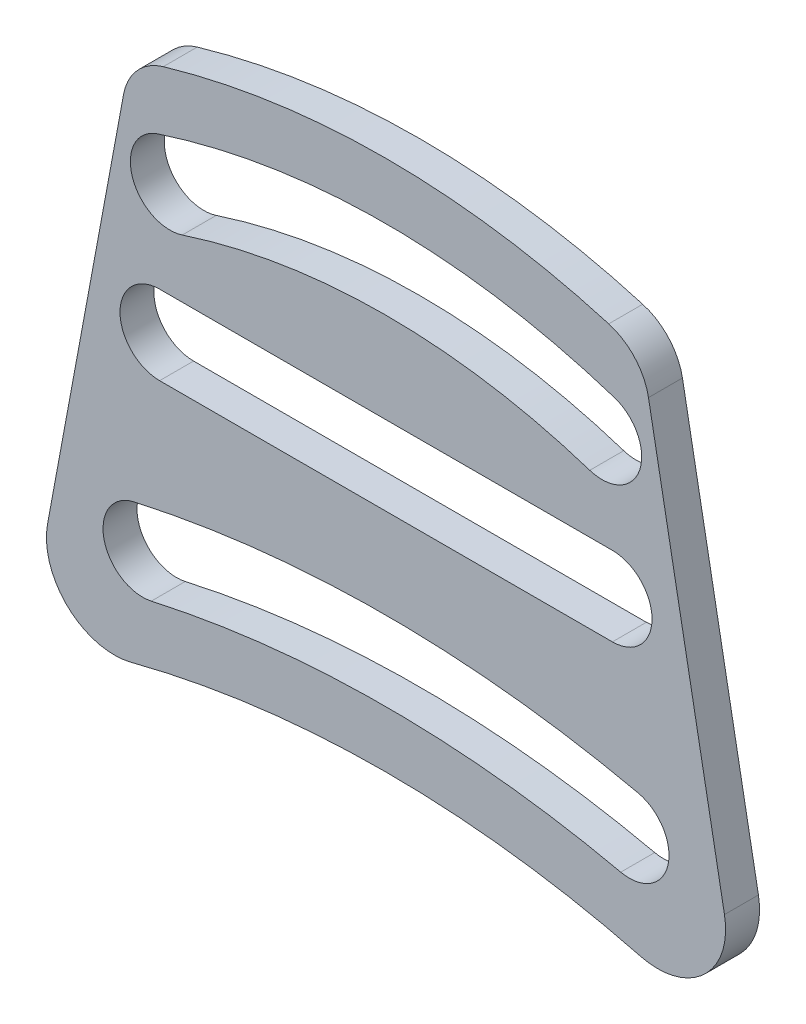
ISO-10303-21;
HEADER;
FILE_DESCRIPTION(('STEP AP214'),'2;1');
FILE_NAME('part.step','',(''),(''),'','','');
FILE_SCHEMA(('AUTOMOTIVE_DESIGN { 1 0 10303 214 1 1 1 1 }'));
ENDSEC;
DATA;
#1=APPLICATION_CONTEXT('core data for automotive mechanical design processes');
#2=APPLICATION_PROTOCOL_DEFINITION('international standard','automotive_design',2000,#1);
#3=PRODUCT_CONTEXT('',#1,'mechanical');
#4=PRODUCT('Part','Part','',(#3));
#5=PRODUCT_RELATED_PRODUCT_CATEGORY('part','',(#4));
#6=PRODUCT_DEFINITION_FORMATION('','',#4);
#7=PRODUCT_DEFINITION_CONTEXT('part definition',#1,'design');
#8=PRODUCT_DEFINITION('design','',#6,#7);
#9=PRODUCT_DEFINITION_SHAPE('','',#8);
#10=(LENGTH_UNIT() NAMED_UNIT(*) SI_UNIT(.MILLI.,.METRE.));
#11=(NAMED_UNIT(*) PLANE_ANGLE_UNIT() SI_UNIT($,.RADIAN.));
#12=(NAMED_UNIT(*) SI_UNIT($,.STERADIAN.) SOLID_ANGLE_UNIT());
#13=UNCERTAINTY_MEASURE_WITH_UNIT(LENGTH_MEASURE(1.E-05),#10,'distance_accuracy_value','');
#14=(GEOMETRIC_REPRESENTATION_CONTEXT(3) GLOBAL_UNCERTAINTY_ASSIGNED_CONTEXT((#13)) GLOBAL_UNIT_ASSIGNED_CONTEXT((#10,
#11,#12)) REPRESENTATION_CONTEXT('',''));
#15=CARTESIAN_POINT('',(0.,0.,0.));
#16=DIRECTION('',(0.,0.,1.));
#17=DIRECTION('',(1.,0.,0.));
#18=AXIS2_PLACEMENT_3D('',#15,#16,#17);
#19=CARTESIAN_POINT('',(0.,0.,3.));
#20=DIRECTION('',(0.,0.,1.));
#21=DIRECTION('',(1.,0.,0.));
#22=AXIS2_PLACEMENT_3D('',#19,#20,#21);
#23=PLANE('',#22);
#24=CARTESIAN_POINT('',(-24.,-38.028860434751,3.));
#25=DIRECTION('',(0.,0.,1.));
#26=DIRECTION('',(1.,0.,0.));
#27=AXIS2_PLACEMENT_3D('',#24,#25,#26);
#28=CIRCLE('',#27,6.);
#29=CARTESIAN_POINT('',(-22.5,-43.8383354540621,3.));
#30=VERTEX_POINT('',#29);
#31=CARTESIAN_POINT('',(-29.8994233722071,-36.9348751169989,3.));
#32=VERTEX_POINT('',#31);
#33=EDGE_CURVE('E263',#30,#32,#28,.F.);
#34=ORIENTED_EDGE('',*,*,#33,.F.);
#35=CARTESIAN_POINT('',(0.,-130.980460743729,3.));
#36=DIRECTION('',(0.,0.,1.));
#37=DIRECTION('',(1.,0.,0.));
#38=AXIS2_PLACEMENT_3D('',#35,#36,#37);
#39=CIRCLE('',#38,90.);
#40=CARTESIAN_POINT('',(22.5,-43.8383354540621,3.));
#41=VERTEX_POINT('',#40);
#42=EDGE_CURVE('E267',#30,#41,#39,.F.);
#43=ORIENTED_EDGE('',*,*,#42,.T.);
#44=CARTESIAN_POINT('',(24.,-38.028860434751,3.));
#45=DIRECTION('',(0.,0.,1.));
#46=DIRECTION('',(1.,0.,0.));
#47=AXIS2_PLACEMENT_3D('',#44,#45,#46);
#48=CIRCLE('',#47,6.);
#49=CARTESIAN_POINT('',(29.8994233722071,-36.9348751169989,3.));
#50=VERTEX_POINT('',#49);
#51=EDGE_CURVE('E271',#41,#50,#48,.T.);
#52=ORIENTED_EDGE('',*,*,#51,.T.);
#53=DIRECTION('',(-0.18233088629201,0.983237228701177,0.));
#54=VECTOR('',#53,1.);
#55=CARTESIAN_POINT('',(22.2839485983631,4.13232125414158,3.));
#56=LINE('',#55,#54);
#57=CARTESIAN_POINT('',(23.1870846036624,-0.737928438873364,3.));
#58=VERTEX_POINT('',#57);
#59=EDGE_CURVE('E274',#50,#58,#56,.T.);
#60=ORIENTED_EDGE('',*,*,#59,.T.);
#61=CARTESIAN_POINT('',(18.2708984601565,-1.64958287033342,3.));
#62=DIRECTION('',(0.,0.,1.));
#63=DIRECTION('',(1.,0.,0.));
#64=AXIS2_PLACEMENT_3D('',#61,#62,#63);
#65=CIRCLE('',#64,5.);
#66=CARTESIAN_POINT('',(19.6763521878609,3.14882309616023,3.));
#67=VERTEX_POINT('',#66);
#68=EDGE_CURVE('E277',#67,#58,#65,.F.);
#69=ORIENTED_EDGE('',*,*,#68,.F.);
#70=CARTESIAN_POINT('',(0.,-64.028860434751,3.));
#71=DIRECTION('',(0.,0.,1.));
#72=DIRECTION('',(1.,0.,0.));
#73=AXIS2_PLACEMENT_3D('',#70,#71,#72);
#74=CIRCLE('',#73,70.);
#75=CARTESIAN_POINT('',(-19.6763521878609,3.14882309616023,3.));
#76=VERTEX_POINT('',#75);
#77=EDGE_CURVE('E281',#76,#67,#74,.F.);
#78=ORIENTED_EDGE('',*,*,#77,.F.);
#79=CARTESIAN_POINT('',(-18.2708984601565,-1.64958287033342,3.));
#80=DIRECTION('',(0.,0.,1.));
#81=DIRECTION('',(1.,0.,0.));
#82=AXIS2_PLACEMENT_3D('',#79,#80,#81);
#83=CIRCLE('',#82,5.);
#84=CARTESIAN_POINT('',(-23.1870846036624,-0.737928438873364,3.));
#85=VERTEX_POINT('',#84);
#86=EDGE_CURVE('E285',#76,#85,#83,.T.);
#87=ORIENTED_EDGE('',*,*,#86,.T.);
#88=DIRECTION('',(0.18233088629201,0.983237228701177,0.));
#89=VECTOR('',#88,1.);
#90=CARTESIAN_POINT('',(-22.2839485983631,4.13232125414158,3.));
#91=LINE('',#90,#89);
#92=EDGE_CURVE('E288',#32,#85,#91,.T.);
#93=ORIENTED_EDGE('',*,*,#92,.F.);
#94=EDGE_LOOP('',(#34,#43,#52,#60,#69,#78,#87,#93));
#95=FACE_BOUND('',#94,.T.);
#96=CARTESIAN_POINT('',(-19.0864097940856,-5.56554748404458,3.));
#97=DIRECTION('',(0.,0.,1.));
#98=DIRECTION('',(1.,0.,0.));
#99=AXIS2_PLACEMENT_3D('',#96,#97,#98);
#100=CIRCLE('',#99,3.49999999999999);
#101=CARTESIAN_POINT('',(-20.1726282376514,-2.23836707221577,3.));
#102=VERTEX_POINT('',#101);
#103=CARTESIAN_POINT('',(-18.0001913505198,-8.89272789587339,3.));
#104=VERTEX_POINT('',#103);
#105=EDGE_CURVE('E292',#102,#104,#100,.T.);
#106=ORIENTED_EDGE('',*,*,#105,.F.);
#107=CARTESIAN_POINT('',(0.,-64.028860434751,3.));
#108=DIRECTION('',(0.,0.,1.));
#109=DIRECTION('',(1.,0.,0.));
#110=AXIS2_PLACEMENT_3D('',#107,#108,#109);
#111=CIRCLE('',#110,65.);
#112=CARTESIAN_POINT('',(20.1726282376514,-2.23836707221578,3.));
#113=VERTEX_POINT('',#112);
#114=EDGE_CURVE('E296',#113,#102,#111,.T.);
#115=ORIENTED_EDGE('',*,*,#114,.F.);
#116=CARTESIAN_POINT('',(19.0864097940856,-5.56554748404458,3.));
#117=DIRECTION('',(0.,0.,1.));
#118=DIRECTION('',(1.,0.,0.));
#119=AXIS2_PLACEMENT_3D('',#116,#117,#118);
#120=CIRCLE('',#119,3.49999999999999);
#121=CARTESIAN_POINT('',(18.0001913505197,-8.89272789587339,3.));
#122=VERTEX_POINT('',#121);
#123=EDGE_CURVE('E300',#122,#113,#120,.T.);
#124=ORIENTED_EDGE('',*,*,#123,.F.);
#125=CARTESIAN_POINT('',(0.,-64.028860434751,3.));
#126=DIRECTION('',(0.,0.,1.));
#127=DIRECTION('',(1.,0.,0.));
#128=AXIS2_PLACEMENT_3D('',#125,#126,#127);
#129=CIRCLE('',#128,58.);
#130=EDGE_CURVE('E304',#122,#104,#129,.T.);
#131=ORIENTED_EDGE('',*,*,#130,.T.);
#132=EDGE_LOOP('',(#106,#115,#124,#131));
#133=FACE_BOUND('',#132,.T.);
#134=CARTESIAN_POINT('',(20.0000034189716,-17.5208455907472,3.));
#135=DIRECTION('',(0.,0.,1.));
#136=DIRECTION('',(1.,0.,0.));
#137=AXIS2_PLACEMENT_3D('',#134,#135,#136);
#138=CIRCLE('',#137,3.5);
#139=CARTESIAN_POINT('',(20.0000034189716,-21.0208455907472,3.));
#140=VERTEX_POINT('',#139);
#141=CARTESIAN_POINT('',(20.0000034189716,-14.0208455907472,3.));
#142=VERTEX_POINT('',#141);
#143=EDGE_CURVE('E307',#140,#142,#138,.T.);
#144=ORIENTED_EDGE('',*,*,#143,.F.);
#145=DIRECTION('',(0.999999919670687,0.000400822428792743,0.));
#146=VECTOR('',#145,1.);
#147=CARTESIAN_POINT('',(0.00842883888107348,-21.0288586628694,3.));
#148=LINE('',#147,#146);
#149=CARTESIAN_POINT('',(-19.9999933678559,-21.0368784878989,3.));
#150=VERTEX_POINT('',#149);
#151=EDGE_CURVE('E311',#150,#140,#148,.T.);
#152=ORIENTED_EDGE('',*,*,#151,.F.);
#153=CARTESIAN_POINT('',(-19.9999933678559,-17.5368784878989,3.));
#154=DIRECTION('',(0.,0.,1.));
#155=DIRECTION('',(1.,0.,0.));
#156=AXIS2_PLACEMENT_3D('',#153,#154,#155);
#157=CIRCLE('',#156,3.5);
#158=CARTESIAN_POINT('',(-19.9999933678559,-14.0368784878989,3.));
#159=VERTEX_POINT('',#158);
#160=EDGE_CURVE('E315',#159,#150,#157,.T.);
#161=ORIENTED_EDGE('',*,*,#160,.F.);
#162=DIRECTION('',(0.999999919670687,0.0004008224287927,0.));
#163=VECTOR('',#162,1.);
#164=CARTESIAN_POINT('',(0.0056230821049082,-14.0288597874798,3.));
#165=LINE('',#164,#163);
#166=EDGE_CURVE('E319',#159,#142,#165,.T.);
#167=ORIENTED_EDGE('',*,*,#166,.T.);
#168=EDGE_LOOP('',(#144,#152,#161,#167));
#169=FACE_BOUND('',#168,.T.);
#170=CARTESIAN_POINT('',(0.,-130.980460743729,3.));
#171=DIRECTION('',(0.,0.,1.));
#172=DIRECTION('',(1.,0.,0.));
#173=AXIS2_PLACEMENT_3D('',#170,#171,#172);
#174=CIRCLE('',#173,102.);
#175=CARTESIAN_POINT('',(22.263959390863,-31.4399357690133,3.));
#176=VERTEX_POINT('',#175);
#177=CARTESIAN_POINT('',(-22.263959390863,-31.4399357690133,3.));
#178=VERTEX_POINT('',#177);
#179=EDGE_CURVE('E225',#176,#178,#174,.T.);
#180=ORIENTED_EDGE('',*,*,#179,.F.);
#181=CARTESIAN_POINT('',(21.5000000000001,-34.8555420181457,3.));
#182=DIRECTION('',(0.,0.,1.));
#183=DIRECTION('',(1.,0.,0.));
#184=AXIS2_PLACEMENT_3D('',#181,#182,#183);
#185=CIRCLE('',#184,3.5);
#186=CARTESIAN_POINT('',(20.7360406091371,-38.2711482672781,3.));
#187=VERTEX_POINT('',#186);
#188=EDGE_CURVE('E216',#187,#176,#185,.T.);
#189=ORIENTED_EDGE('',*,*,#188,.F.);
#190=CARTESIAN_POINT('',(0.,-130.980460743729,3.));
#191=DIRECTION('',(0.,0.,1.));
#192=DIRECTION('',(1.,0.,0.));
#193=AXIS2_PLACEMENT_3D('',#190,#191,#192);
#194=CIRCLE('',#193,95.);
#195=CARTESIAN_POINT('',(-20.7360406091371,-38.2711482672781,3.));
#196=VERTEX_POINT('',#195);
#197=EDGE_CURVE('E242',#187,#196,#194,.T.);
#198=ORIENTED_EDGE('',*,*,#197,.T.);
#199=CARTESIAN_POINT('',(-21.5000000000001,-34.8555420181457,3.));
#200=DIRECTION('',(0.,0.,1.));
#201=DIRECTION('',(1.,0.,0.));
#202=AXIS2_PLACEMENT_3D('',#199,#200,#201);
#203=CIRCLE('',#202,3.5);
#204=EDGE_CURVE('E238',#178,#196,#203,.T.);
#205=ORIENTED_EDGE('',*,*,#204,.F.);
#206=EDGE_LOOP('',(#180,#189,#198,#205));
#207=FACE_BOUND('',#206,.T.);
#208=ADVANCED_FACE('F77',(#95,#133,#169,#207),#23,.T.);
#209=CARTESIAN_POINT('',(0.,0.,0.));
#210=DIRECTION('',(0.,0.,1.));
#211=DIRECTION('',(1.,0.,0.));
#212=AXIS2_PLACEMENT_3D('',#209,#210,#211);
#213=PLANE('',#212);
#214=CARTESIAN_POINT('',(20.0000034189716,-17.5208455907472,0.));
#215=DIRECTION('',(0.,0.,1.));
#216=DIRECTION('',(1.,0.,0.));
#217=AXIS2_PLACEMENT_3D('',#214,#215,#216);
#218=CIRCLE('',#217,3.5);
#219=CARTESIAN_POINT('',(20.0000034189716,-21.0208455907472,0.));
#220=VERTEX_POINT('',#219);
#221=CARTESIAN_POINT('',(20.0000034189716,-14.0208455907472,0.));
#222=VERTEX_POINT('',#221);
#223=EDGE_CURVE('E368',#220,#222,#218,.T.);
#224=ORIENTED_EDGE('',*,*,#223,.T.);
#225=DIRECTION('',(0.999999919670687,0.0004008224287927,0.));
#226=VECTOR('',#225,1.);
#227=CARTESIAN_POINT('',(0.0056230821049082,-14.0288597874798,0.));
#228=LINE('',#227,#226);
#229=CARTESIAN_POINT('',(-19.9999933678559,-14.0368784878989,0.));
#230=VERTEX_POINT('',#229);
#231=EDGE_CURVE('E268',#230,#222,#228,.T.);
#232=ORIENTED_EDGE('',*,*,#231,.F.);
#233=CARTESIAN_POINT('',(-19.9999933678559,-17.5368784878989,0.));
#234=DIRECTION('',(0.,0.,1.));
#235=DIRECTION('',(1.,0.,0.));
#236=AXIS2_PLACEMENT_3D('',#233,#234,#235);
#237=CIRCLE('',#236,3.5);
#238=CARTESIAN_POINT('',(-19.9999933678559,-21.0368784878989,0.));
#239=VERTEX_POINT('',#238);
#240=EDGE_CURVE('E376',#230,#239,#237,.T.);
#241=ORIENTED_EDGE('',*,*,#240,.T.);
#242=DIRECTION('',(0.999999919670687,0.000400822428792743,0.));
#243=VECTOR('',#242,1.);
#244=CARTESIAN_POINT('',(0.00842883888107348,-21.0288586628694,0.));
#245=LINE('',#244,#243);
#246=EDGE_CURVE('E372',#239,#220,#245,.T.);
#247=ORIENTED_EDGE('',*,*,#246,.T.);
#248=EDGE_LOOP('',(#224,#232,#241,#247));
#249=FACE_BOUND('',#248,.T.);
#250=CARTESIAN_POINT('',(-19.0864097940856,-5.56554748404458,0.));
#251=DIRECTION('',(0.,0.,1.));
#252=DIRECTION('',(1.,0.,0.));
#253=AXIS2_PLACEMENT_3D('',#250,#251,#252);
#254=CIRCLE('',#253,3.49999999999999);
#255=CARTESIAN_POINT('',(-20.1726282376514,-2.23836707221577,0.));
#256=VERTEX_POINT('',#255);
#257=CARTESIAN_POINT('',(-18.0001913505198,-8.89272789587339,0.));
#258=VERTEX_POINT('',#257);
#259=EDGE_CURVE('E352',#256,#258,#254,.T.);
#260=ORIENTED_EDGE('',*,*,#259,.T.);
#261=CARTESIAN_POINT('',(0.,-64.028860434751,0.));
#262=DIRECTION('',(0.,0.,1.));
#263=DIRECTION('',(1.,0.,0.));
#264=AXIS2_PLACEMENT_3D('',#261,#262,#263);
#265=CIRCLE('',#264,58.);
#266=CARTESIAN_POINT('',(18.0001913505197,-8.89272789587339,0.));
#267=VERTEX_POINT('',#266);
#268=EDGE_CURVE('E364',#267,#258,#265,.T.);
#269=ORIENTED_EDGE('',*,*,#268,.F.);
#270=CARTESIAN_POINT('',(19.0864097940856,-5.56554748404458,0.));
#271=DIRECTION('',(0.,0.,1.));
#272=DIRECTION('',(1.,0.,0.));
#273=AXIS2_PLACEMENT_3D('',#270,#271,#272);
#274=CIRCLE('',#273,3.49999999999999);
#275=CARTESIAN_POINT('',(20.1726282376514,-2.23836707221578,0.));
#276=VERTEX_POINT('',#275);
#277=EDGE_CURVE('E360',#267,#276,#274,.T.);
#278=ORIENTED_EDGE('',*,*,#277,.T.);
#279=CARTESIAN_POINT('',(0.,-64.028860434751,0.));
#280=DIRECTION('',(0.,0.,1.));
#281=DIRECTION('',(1.,0.,0.));
#282=AXIS2_PLACEMENT_3D('',#279,#280,#281);
#283=CIRCLE('',#282,65.);
#284=EDGE_CURVE('E356',#276,#256,#283,.T.);
#285=ORIENTED_EDGE('',*,*,#284,.T.);
#286=EDGE_LOOP('',(#260,#269,#278,#285));
#287=FACE_BOUND('',#286,.T.);
#288=CARTESIAN_POINT('',(-24.,-38.028860434751,0.));
#289=DIRECTION('',(0.,0.,1.));
#290=DIRECTION('',(1.,0.,0.));
#291=AXIS2_PLACEMENT_3D('',#288,#289,#290);
#292=CIRCLE('',#291,6.);
#293=CARTESIAN_POINT('',(-22.5,-43.8383354540621,0.));
#294=VERTEX_POINT('',#293);
#295=CARTESIAN_POINT('',(-29.8994233722071,-36.9348751169989,0.));
#296=VERTEX_POINT('',#295);
#297=EDGE_CURVE('E234',#294,#296,#292,.F.);
#298=ORIENTED_EDGE('',*,*,#297,.T.);
#299=DIRECTION('',(0.18233088629201,0.983237228701177,0.));
#300=VECTOR('',#299,1.);
#301=CARTESIAN_POINT('',(-22.2839485983631,4.13232125414158,0.));
#302=LINE('',#301,#300);
#303=CARTESIAN_POINT('',(-23.1870846036624,-0.737928438873364,0.));
#304=VERTEX_POINT('',#303);
#305=EDGE_CURVE('E348',#296,#304,#302,.T.);
#306=ORIENTED_EDGE('',*,*,#305,.T.);
#307=CARTESIAN_POINT('',(-18.2708984601565,-1.64958287033342,0.));
#308=DIRECTION('',(0.,0.,1.));
#309=DIRECTION('',(1.,0.,0.));
#310=AXIS2_PLACEMENT_3D('',#307,#308,#309);
#311=CIRCLE('',#310,5.);
#312=CARTESIAN_POINT('',(-19.6763521878609,3.14882309616023,0.));
#313=VERTEX_POINT('',#312);
#314=EDGE_CURVE('E344',#313,#304,#311,.T.);
#315=ORIENTED_EDGE('',*,*,#314,.F.);
#316=CARTESIAN_POINT('',(0.,-64.028860434751,0.));
#317=DIRECTION('',(0.,0.,1.));
#318=DIRECTION('',(1.,0.,0.));
#319=AXIS2_PLACEMENT_3D('',#316,#317,#318);
#320=CIRCLE('',#319,70.);
#321=CARTESIAN_POINT('',(19.6763521878609,3.14882309616023,0.));
#322=VERTEX_POINT('',#321);
#323=EDGE_CURVE('E340',#313,#322,#320,.F.);
#324=ORIENTED_EDGE('',*,*,#323,.T.);
#325=CARTESIAN_POINT('',(18.2708984601565,-1.64958287033342,0.));
#326=DIRECTION('',(0.,0.,1.));
#327=DIRECTION('',(1.,0.,0.));
#328=AXIS2_PLACEMENT_3D('',#325,#326,#327);
#329=CIRCLE('',#328,5.);
#330=CARTESIAN_POINT('',(23.1870846036624,-0.737928438873364,0.));
#331=VERTEX_POINT('',#330);
#332=EDGE_CURVE('E336',#322,#331,#329,.F.);
#333=ORIENTED_EDGE('',*,*,#332,.T.);
#334=DIRECTION('',(-0.18233088629201,0.983237228701177,0.));
#335=VECTOR('',#334,1.);
#336=CARTESIAN_POINT('',(22.2839485983631,4.13232125414158,0.));
#337=LINE('',#336,#335);
#338=CARTESIAN_POINT('',(29.8994233722071,-36.9348751169989,0.));
#339=VERTEX_POINT('',#338);
#340=EDGE_CURVE('E332',#339,#331,#337,.T.);
#341=ORIENTED_EDGE('',*,*,#340,.F.);
#342=CARTESIAN_POINT('',(24.,-38.028860434751,0.));
#343=DIRECTION('',(0.,0.,1.));
#344=DIRECTION('',(1.,0.,0.));
#345=AXIS2_PLACEMENT_3D('',#342,#343,#344);
#346=CIRCLE('',#345,6.);
#347=CARTESIAN_POINT('',(22.5,-43.8383354540621,0.));
#348=VERTEX_POINT('',#347);
#349=EDGE_CURVE('E329',#348,#339,#346,.T.);
#350=ORIENTED_EDGE('',*,*,#349,.F.);
#351=CARTESIAN_POINT('',(0.,-130.980460743729,0.));
#352=DIRECTION('',(0.,0.,1.));
#353=DIRECTION('',(1.,0.,0.));
#354=AXIS2_PLACEMENT_3D('',#351,#352,#353);
#355=CIRCLE('',#354,90.);
#356=EDGE_CURVE('E326',#294,#348,#355,.F.);
#357=ORIENTED_EDGE('',*,*,#356,.F.);
#358=EDGE_LOOP('',(#298,#306,#315,#324,#333,#341,#350,#357));
#359=FACE_BOUND('',#358,.T.);
#360=CARTESIAN_POINT('',(21.5000000000001,-34.8555420181457,0.));
#361=DIRECTION('',(0.,0.,1.));
#362=DIRECTION('',(1.,0.,0.));
#363=AXIS2_PLACEMENT_3D('',#360,#361,#362);
#364=CIRCLE('',#363,3.5);
#365=CARTESIAN_POINT('',(20.7360406091371,-38.2711482672781,0.));
#366=VERTEX_POINT('',#365);
#367=CARTESIAN_POINT('',(22.263959390863,-31.4399357690133,0.));
#368=VERTEX_POINT('',#367);
#369=EDGE_CURVE('E103',#366,#368,#364,.T.);
#370=ORIENTED_EDGE('',*,*,#369,.T.);
#371=CARTESIAN_POINT('',(0.,-130.980460743729,0.));
#372=DIRECTION('',(0.,0.,1.));
#373=DIRECTION('',(1.,0.,0.));
#374=AXIS2_PLACEMENT_3D('',#371,#372,#373);
#375=CIRCLE('',#374,102.);
#376=CARTESIAN_POINT('',(-22.263959390863,-31.4399357690133,0.));
#377=VERTEX_POINT('',#376);
#378=EDGE_CURVE('E232',#368,#377,#375,.T.);
#379=ORIENTED_EDGE('',*,*,#378,.T.);
#380=CARTESIAN_POINT('',(-21.5000000000001,-34.8555420181457,0.));
#381=DIRECTION('',(0.,0.,1.));
#382=DIRECTION('',(1.,0.,0.));
#383=AXIS2_PLACEMENT_3D('',#380,#381,#382);
#384=CIRCLE('',#383,3.5);
#385=CARTESIAN_POINT('',(-20.7360406091371,-38.2711482672781,0.));
#386=VERTEX_POINT('',#385);
#387=EDGE_CURVE('E251',#377,#386,#384,.T.);
#388=ORIENTED_EDGE('',*,*,#387,.T.);
#389=CARTESIAN_POINT('',(0.,-130.980460743729,0.));
#390=DIRECTION('',(0.,0.,1.));
#391=DIRECTION('',(1.,0.,0.));
#392=AXIS2_PLACEMENT_3D('',#389,#390,#391);
#393=CIRCLE('',#392,95.);
#394=EDGE_CURVE('E226',#366,#386,#393,.T.);
#395=ORIENTED_EDGE('',*,*,#394,.F.);
#396=EDGE_LOOP('',(#370,#379,#388,#395));
#397=FACE_BOUND('',#396,.T.);
#398=ADVANCED_FACE('F436',(#249,#287,#359,#397),#213,.F.);
#399=CARTESIAN_POINT('',(20.0000034189716,-17.5208455907472,3.));
#400=DIRECTION('',(0.,0.,-1.));
#401=DIRECTION('',(-1.,0.,0.));
#402=AXIS2_PLACEMENT_3D('',#399,#400,#401);
#403=CYLINDRICAL_SURFACE('',#402,3.5);
#404=ORIENTED_EDGE('',*,*,#223,.F.);
#405=DIRECTION('',(0.,0.,-1.));
#406=VECTOR('',#405,1.);
#407=CARTESIAN_POINT('',(20.0000034189716,-21.0208455907472,3.));
#408=LINE('',#407,#406);
#409=EDGE_CURVE('E12',#140,#220,#408,.T.);
#410=ORIENTED_EDGE('',*,*,#409,.F.);
#411=ORIENTED_EDGE('',*,*,#143,.T.);
#412=DIRECTION('',(0.,0.,-1.));
#413=VECTOR('',#412,1.);
#414=CARTESIAN_POINT('',(20.0000034189716,-14.0208455907472,3.));
#415=LINE('',#414,#413);
#416=EDGE_CURVE('E383',#142,#222,#415,.T.);
#417=ORIENTED_EDGE('',*,*,#416,.T.);
#418=EDGE_LOOP('',(#404,#410,#411,#417));
#419=FACE_BOUND('',#418,.T.);
#420=ADVANCED_FACE('F480',(#419),#403,.F.);
#421=CARTESIAN_POINT('',(0.00842883888107348,-21.0288586628694,3.));
#422=DIRECTION('',(-0.000400822428792743,0.999999919670687,0.));
#423=DIRECTION('',(-0.999999919670687,-0.000400822428792743,0.));
#424=AXIS2_PLACEMENT_3D('',#421,#422,#423);
#425=PLANE('',#424);
#426=ORIENTED_EDGE('',*,*,#246,.F.);
#427=DIRECTION('',(0.,0.,-1.));
#428=VECTOR('',#427,1.);
#429=CARTESIAN_POINT('',(-19.9999933678559,-21.0368784878989,3.));
#430=LINE('',#429,#428);
#431=EDGE_CURVE('E87',#150,#239,#430,.T.);
#432=ORIENTED_EDGE('',*,*,#431,.F.);
#433=ORIENTED_EDGE('',*,*,#151,.T.);
#434=ORIENTED_EDGE('',*,*,#409,.T.);
#435=EDGE_LOOP('',(#426,#432,#433,#434));
#436=FACE_BOUND('',#435,.T.);
#437=ADVANCED_FACE('F494',(#436),#425,.T.);
#438=CARTESIAN_POINT('',(-19.9999933678559,-17.5368784878989,3.));
#439=DIRECTION('',(0.,0.,-1.));
#440=DIRECTION('',(-1.,0.,0.));
#441=AXIS2_PLACEMENT_3D('',#438,#439,#440);
#442=CYLINDRICAL_SURFACE('',#441,3.5);
#443=ORIENTED_EDGE('',*,*,#240,.F.);
#444=DIRECTION('',(0.,0.,-1.));
#445=VECTOR('',#444,1.);
#446=CARTESIAN_POINT('',(-19.9999933678559,-14.0368784878989,3.));
#447=LINE('',#446,#445);
#448=EDGE_CURVE('E386',#159,#230,#447,.T.);
#449=ORIENTED_EDGE('',*,*,#448,.F.);
#450=ORIENTED_EDGE('',*,*,#160,.T.);
#451=ORIENTED_EDGE('',*,*,#431,.T.);
#452=EDGE_LOOP('',(#443,#449,#450,#451));
#453=FACE_BOUND('',#452,.T.);
#454=ADVANCED_FACE('F490',(#453),#442,.F.);
#455=CARTESIAN_POINT('',(-19.0864097940856,-5.56554748404458,3.));
#456=DIRECTION('',(0.,0.,-1.));
#457=DIRECTION('',(-1.,0.,0.));
#458=AXIS2_PLACEMENT_3D('',#455,#456,#457);
#459=CYLINDRICAL_SURFACE('',#458,3.49999999999999);
#460=ORIENTED_EDGE('',*,*,#259,.F.);
#461=DIRECTION('',(0.,0.,-1.));
#462=VECTOR('',#461,1.);
#463=CARTESIAN_POINT('',(-20.1726282376514,-2.23836707221577,3.));
#464=LINE('',#463,#462);
#465=EDGE_CURVE('E387',#102,#256,#464,.T.);
#466=ORIENTED_EDGE('',*,*,#465,.F.);
#467=ORIENTED_EDGE('',*,*,#105,.T.);
#468=DIRECTION('',(0.,0.,-1.));
#469=VECTOR('',#468,1.);
#470=CARTESIAN_POINT('',(-18.0001913505198,-8.89272789587339,3.));
#471=LINE('',#470,#469);
#472=EDGE_CURVE('E392',#104,#258,#471,.T.);
#473=ORIENTED_EDGE('',*,*,#472,.T.);
#474=EDGE_LOOP('',(#460,#466,#467,#473));
#475=FACE_BOUND('',#474,.T.);
#476=ADVANCED_FACE('F493',(#475),#459,.F.);
#477=CARTESIAN_POINT('',(0.,-64.028860434751,3.));
#478=DIRECTION('',(0.,0.,-1.));
#479=DIRECTION('',(-1.,0.,0.));
#480=AXIS2_PLACEMENT_3D('',#477,#478,#479);
#481=CYLINDRICAL_SURFACE('',#480,65.);
#482=ORIENTED_EDGE('',*,*,#284,.F.);
#483=DIRECTION('',(0.,0.,-1.));
#484=VECTOR('',#483,1.);
#485=CARTESIAN_POINT('',(20.1726282376514,-2.23836707221578,3.));
#486=LINE('',#485,#484);
#487=EDGE_CURVE('E398',#113,#276,#486,.T.);
#488=ORIENTED_EDGE('',*,*,#487,.F.);
#489=ORIENTED_EDGE('',*,*,#114,.T.);
#490=ORIENTED_EDGE('',*,*,#465,.T.);
#491=EDGE_LOOP('',(#482,#488,#489,#490));
#492=FACE_BOUND('',#491,.T.);
#493=ADVANCED_FACE('F505',(#492),#481,.F.);
#494=CARTESIAN_POINT('',(19.0864097940856,-5.56554748404458,3.));
#495=DIRECTION('',(0.,0.,-1.));
#496=DIRECTION('',(-1.,0.,0.));
#497=AXIS2_PLACEMENT_3D('',#494,#495,#496);
#498=CYLINDRICAL_SURFACE('',#497,3.49999999999999);
#499=ORIENTED_EDGE('',*,*,#277,.F.);
#500=DIRECTION('',(0.,0.,-1.));
#501=VECTOR('',#500,1.);
#502=CARTESIAN_POINT('',(18.0001913505197,-8.89272789587339,3.));
#503=LINE('',#502,#501);
#504=EDGE_CURVE('E395',#122,#267,#503,.T.);
#505=ORIENTED_EDGE('',*,*,#504,.F.);
#506=ORIENTED_EDGE('',*,*,#123,.T.);
#507=ORIENTED_EDGE('',*,*,#487,.T.);
#508=EDGE_LOOP('',(#499,#505,#506,#507));
#509=FACE_BOUND('',#508,.T.);
#510=ADVANCED_FACE('F502',(#509),#498,.F.);
#511=CARTESIAN_POINT('',(-24.,-38.028860434751,3.));
#512=DIRECTION('',(0.,0.,-1.));
#513=DIRECTION('',(-1.,0.,0.));
#514=AXIS2_PLACEMENT_3D('',#511,#512,#513);
#515=CYLINDRICAL_SURFACE('',#514,6.);
#516=ORIENTED_EDGE('',*,*,#297,.F.);
#517=DIRECTION('',(0.,0.,-1.));
#518=VECTOR('',#517,1.);
#519=CARTESIAN_POINT('',(-22.5,-43.8383354540621,3.));
#520=LINE('',#519,#518);
#521=EDGE_CURVE('E81',#30,#294,#520,.T.);
#522=ORIENTED_EDGE('',*,*,#521,.F.);
#523=ORIENTED_EDGE('',*,*,#33,.T.);
#524=DIRECTION('',(0.,0.,-1.));
#525=VECTOR('',#524,1.);
#526=CARTESIAN_POINT('',(-29.8994233722071,-36.9348751169989,3.));
#527=LINE('',#526,#525);
#528=EDGE_CURVE('E322',#32,#296,#527,.T.);
#529=ORIENTED_EDGE('',*,*,#528,.T.);
#530=EDGE_LOOP('',(#516,#522,#523,#529));
#531=FACE_BOUND('',#530,.T.);
#532=ADVANCED_FACE('F79',(#531),#515,.T.);
#533=CARTESIAN_POINT('',(0.,-130.980460743729,3.));
#534=DIRECTION('',(0.,0.,-1.));
#535=DIRECTION('',(-1.,0.,0.));
#536=AXIS2_PLACEMENT_3D('',#533,#534,#535);
#537=CYLINDRICAL_SURFACE('',#536,90.);
#538=ORIENTED_EDGE('',*,*,#356,.T.);
#539=DIRECTION('',(0.,0.,-1.));
#540=VECTOR('',#539,1.);
#541=CARTESIAN_POINT('',(22.5,-43.8383354540621,3.));
#542=LINE('',#541,#540);
#543=EDGE_CURVE('E420',#41,#348,#542,.T.);
#544=ORIENTED_EDGE('',*,*,#543,.F.);
#545=ORIENTED_EDGE('',*,*,#42,.F.);
#546=ORIENTED_EDGE('',*,*,#521,.T.);
#547=EDGE_LOOP('',(#538,#544,#545,#546));
#548=FACE_BOUND('',#547,.T.);
#549=ADVANCED_FACE('F431',(#548),#537,.F.);
#550=CARTESIAN_POINT('',(24.,-38.028860434751,3.));
#551=DIRECTION('',(0.,0.,-1.));
#552=DIRECTION('',(-1.,0.,0.));
#553=AXIS2_PLACEMENT_3D('',#550,#551,#552);
#554=CYLINDRICAL_SURFACE('',#553,6.);
#555=ORIENTED_EDGE('',*,*,#349,.T.);
#556=DIRECTION('',(0.,0.,-1.));
#557=VECTOR('',#556,1.);
#558=CARTESIAN_POINT('',(29.8994233722071,-36.9348751169989,3.));
#559=LINE('',#558,#557);
#560=EDGE_CURVE('E417',#50,#339,#559,.T.);
#561=ORIENTED_EDGE('',*,*,#560,.F.);
#562=ORIENTED_EDGE('',*,*,#51,.F.);
#563=ORIENTED_EDGE('',*,*,#543,.T.);
#564=EDGE_LOOP('',(#555,#561,#562,#563));
#565=FACE_BOUND('',#564,.T.);
#566=ADVANCED_FACE('F460',(#565),#554,.T.);
#567=CARTESIAN_POINT('',(22.2839485983631,4.13232125414158,3.));
#568=DIRECTION('',(-0.983237228701177,-0.18233088629201,0.));
#569=DIRECTION('',(0.18233088629201,-0.983237228701177,0.));
#570=AXIS2_PLACEMENT_3D('',#567,#568,#569);
#571=PLANE('',#570);
#572=ORIENTED_EDGE('',*,*,#340,.T.);
#573=DIRECTION('',(0.,0.,-1.));
#574=VECTOR('',#573,1.);
#575=CARTESIAN_POINT('',(23.1870846036624,-0.737928438873364,3.));
#576=LINE('',#575,#574);
#577=EDGE_CURVE('E414',#58,#331,#576,.T.);
#578=ORIENTED_EDGE('',*,*,#577,.F.);
#579=ORIENTED_EDGE('',*,*,#59,.F.);
#580=ORIENTED_EDGE('',*,*,#560,.T.);
#581=EDGE_LOOP('',(#572,#578,#579,#580));
#582=FACE_BOUND('',#581,.T.);
#583=ADVANCED_FACE('F457',(#582),#571,.F.);
#584=CARTESIAN_POINT('',(18.2708984601565,-1.64958287033342,3.));
#585=DIRECTION('',(0.,0.,-1.));
#586=DIRECTION('',(-1.,0.,0.));
#587=AXIS2_PLACEMENT_3D('',#584,#585,#586);
#588=CYLINDRICAL_SURFACE('',#587,5.);
#589=ORIENTED_EDGE('',*,*,#332,.F.);
#590=DIRECTION('',(0.,0.,-1.));
#591=VECTOR('',#590,1.);
#592=CARTESIAN_POINT('',(19.6763521878609,3.14882309616023,3.));
#593=LINE('',#592,#591);
#594=EDGE_CURVE('E411',#67,#322,#593,.T.);
#595=ORIENTED_EDGE('',*,*,#594,.F.);
#596=ORIENTED_EDGE('',*,*,#68,.T.);
#597=ORIENTED_EDGE('',*,*,#577,.T.);
#598=EDGE_LOOP('',(#589,#595,#596,#597));
#599=FACE_BOUND('',#598,.T.);
#600=ADVANCED_FACE('F454',(#599),#588,.T.);
#601=CARTESIAN_POINT('',(0.,-64.028860434751,3.));
#602=DIRECTION('',(0.,0.,-1.));
#603=DIRECTION('',(-1.,0.,0.));
#604=AXIS2_PLACEMENT_3D('',#601,#602,#603);
#605=CYLINDRICAL_SURFACE('',#604,70.);
#606=ORIENTED_EDGE('',*,*,#323,.F.);
#607=DIRECTION('',(0.,0.,-1.));
#608=VECTOR('',#607,1.);
#609=CARTESIAN_POINT('',(-19.6763521878609,3.14882309616023,3.));
#610=LINE('',#609,#608);
#611=EDGE_CURVE('E408',#76,#313,#610,.T.);
#612=ORIENTED_EDGE('',*,*,#611,.F.);
#613=ORIENTED_EDGE('',*,*,#77,.T.);
#614=ORIENTED_EDGE('',*,*,#594,.T.);
#615=EDGE_LOOP('',(#606,#612,#613,#614));
#616=FACE_BOUND('',#615,.T.);
#617=ADVANCED_FACE('F448',(#616),#605,.T.);
#618=CARTESIAN_POINT('',(-18.2708984601565,-1.64958287033342,3.));
#619=DIRECTION('',(0.,0.,-1.));
#620=DIRECTION('',(-1.,0.,0.));
#621=AXIS2_PLACEMENT_3D('',#618,#619,#620);
#622=CYLINDRICAL_SURFACE('',#621,5.);
#623=ORIENTED_EDGE('',*,*,#314,.T.);
#624=DIRECTION('',(0.,0.,-1.));
#625=VECTOR('',#624,1.);
#626=CARTESIAN_POINT('',(-23.1870846036624,-0.737928438873364,3.));
#627=LINE('',#626,#625);
#628=EDGE_CURVE('E405',#85,#304,#627,.T.);
#629=ORIENTED_EDGE('',*,*,#628,.F.);
#630=ORIENTED_EDGE('',*,*,#86,.F.);
#631=ORIENTED_EDGE('',*,*,#611,.T.);
#632=EDGE_LOOP('',(#623,#629,#630,#631));
#633=FACE_BOUND('',#632,.T.);
#634=ADVANCED_FACE('F463',(#633),#622,.T.);
#635=CARTESIAN_POINT('',(0.,-64.028860434751,3.));
#636=DIRECTION('',(0.,0.,-1.));
#637=DIRECTION('',(-1.,0.,0.));
#638=AXIS2_PLACEMENT_3D('',#635,#636,#637);
#639=CYLINDRICAL_SURFACE('',#638,58.);
#640=ORIENTED_EDGE('',*,*,#268,.T.);
#641=ORIENTED_EDGE('',*,*,#472,.F.);
#642=ORIENTED_EDGE('',*,*,#130,.F.);
#643=ORIENTED_EDGE('',*,*,#504,.T.);
#644=EDGE_LOOP('',(#640,#641,#642,#643));
#645=FACE_BOUND('',#644,.T.);
#646=ADVANCED_FACE('F465',(#645),#639,.T.);
#647=CARTESIAN_POINT('',(-22.2839485983631,4.13232125414158,3.));
#648=DIRECTION('',(-0.983237228701177,0.18233088629201,0.));
#649=DIRECTION('',(-0.18233088629201,-0.983237228701177,0.));
#650=AXIS2_PLACEMENT_3D('',#647,#648,#649);
#651=PLANE('',#650);
#652=ORIENTED_EDGE('',*,*,#305,.F.);
#653=ORIENTED_EDGE('',*,*,#528,.F.);
#654=ORIENTED_EDGE('',*,*,#92,.T.);
#655=ORIENTED_EDGE('',*,*,#628,.T.);
#656=EDGE_LOOP('',(#652,#653,#654,#655));
#657=FACE_BOUND('',#656,.T.);
#658=ADVANCED_FACE('F442',(#657),#651,.T.);
#659=CARTESIAN_POINT('',(0.0056230821049082,-14.0288597874798,3.));
#660=DIRECTION('',(-0.0004008224287927,0.999999919670687,0.));
#661=DIRECTION('',(-0.999999919670687,-0.0004008224287927,0.));
#662=AXIS2_PLACEMENT_3D('',#659,#660,#661);
#663=PLANE('',#662);
#664=ORIENTED_EDGE('',*,*,#231,.T.);
#665=ORIENTED_EDGE('',*,*,#416,.F.);
#666=ORIENTED_EDGE('',*,*,#166,.F.);
#667=ORIENTED_EDGE('',*,*,#448,.T.);
#668=EDGE_LOOP('',(#664,#665,#666,#667));
#669=FACE_BOUND('',#668,.T.);
#670=ADVANCED_FACE('F486',(#669),#663,.F.);
#671=CARTESIAN_POINT('',(21.5000000000001,-34.8555420181457,3.));
#672=DIRECTION('',(0.,0.,-1.));
#673=DIRECTION('',(-1.,0.,0.));
#674=AXIS2_PLACEMENT_3D('',#671,#672,#673);
#675=CYLINDRICAL_SURFACE('',#674,3.5);
#676=ORIENTED_EDGE('',*,*,#369,.F.);
#677=DIRECTION('',(0.,0.,-1.));
#678=VECTOR('',#677,1.);
#679=CARTESIAN_POINT('',(20.7360406091371,-38.2711482672781,3.));
#680=LINE('',#679,#678);
#681=EDGE_CURVE('E220',#187,#366,#680,.T.);
#682=ORIENTED_EDGE('',*,*,#681,.F.);
#683=ORIENTED_EDGE('',*,*,#188,.T.);
#684=DIRECTION('',(0.,0.,-1.));
#685=VECTOR('',#684,1.);
#686=CARTESIAN_POINT('',(22.263959390863,-31.4399357690133,3.));
#687=LINE('',#686,#685);
#688=EDGE_CURVE('E219',#176,#368,#687,.T.);
#689=ORIENTED_EDGE('',*,*,#688,.T.);
#690=EDGE_LOOP('',(#676,#682,#683,#689));
#691=FACE_BOUND('',#690,.T.);
#692=ADVANCED_FACE('F218',(#691),#675,.F.);
#693=CARTESIAN_POINT('',(0.,-130.980460743729,3.));
#694=DIRECTION('',(0.,0.,-1.));
#695=DIRECTION('',(-1.,0.,0.));
#696=AXIS2_PLACEMENT_3D('',#693,#694,#695);
#697=CYLINDRICAL_SURFACE('',#696,102.);
#698=ORIENTED_EDGE('',*,*,#378,.F.);
#699=ORIENTED_EDGE('',*,*,#688,.F.);
#700=ORIENTED_EDGE('',*,*,#179,.T.);
#701=DIRECTION('',(0.,0.,-1.));
#702=VECTOR('',#701,1.);
#703=CARTESIAN_POINT('',(-22.263959390863,-31.4399357690133,3.));
#704=LINE('',#703,#702);
#705=EDGE_CURVE('E235',#178,#377,#704,.T.);
#706=ORIENTED_EDGE('',*,*,#705,.T.);
#707=EDGE_LOOP('',(#698,#699,#700,#706));
#708=FACE_BOUND('',#707,.T.);
#709=ADVANCED_FACE('F229',(#708),#697,.F.);
#710=CARTESIAN_POINT('',(-21.5000000000001,-34.8555420181457,3.));
#711=DIRECTION('',(0.,0.,-1.));
#712=DIRECTION('',(-1.,0.,0.));
#713=AXIS2_PLACEMENT_3D('',#710,#711,#712);
#714=CYLINDRICAL_SURFACE('',#713,3.5);
#715=ORIENTED_EDGE('',*,*,#387,.F.);
#716=ORIENTED_EDGE('',*,*,#705,.F.);
#717=ORIENTED_EDGE('',*,*,#204,.T.);
#718=DIRECTION('',(0.,0.,-1.));
#719=VECTOR('',#718,1.);
#720=CARTESIAN_POINT('',(-20.7360406091371,-38.2711482672781,3.));
#721=LINE('',#720,#719);
#722=EDGE_CURVE('E95',#196,#386,#721,.T.);
#723=ORIENTED_EDGE('',*,*,#722,.T.);
#724=EDGE_LOOP('',(#715,#716,#717,#723));
#725=FACE_BOUND('',#724,.T.);
#726=ADVANCED_FACE('F532',(#725),#714,.F.);
#727=CARTESIAN_POINT('',(0.,-130.980460743729,3.));
#728=DIRECTION('',(0.,0.,-1.));
#729=DIRECTION('',(-1.,0.,0.));
#730=AXIS2_PLACEMENT_3D('',#727,#728,#729);
#731=CYLINDRICAL_SURFACE('',#730,95.);
#732=ORIENTED_EDGE('',*,*,#394,.T.);
#733=ORIENTED_EDGE('',*,*,#722,.F.);
#734=ORIENTED_EDGE('',*,*,#197,.F.);
#735=ORIENTED_EDGE('',*,*,#681,.T.);
#736=EDGE_LOOP('',(#732,#733,#734,#735));
#737=FACE_BOUND('',#736,.T.);
#738=ADVANCED_FACE('F538',(#737),#731,.T.);
#739=CLOSED_SHELL('',(#208,#398,#420,#437,#454,#476,#493,#510,#532,#549,#566,#583,#600,#617,
#634,#646,#658,#670,#692,#709,#726,#738));
#740=MANIFOLD_SOLID_BREP('B2',#739);
#741=ADVANCED_BREP_SHAPE_REPRESENTATION('',(#18,#740),#14);
#742=SHAPE_DEFINITION_REPRESENTATION(#9,#741);
ENDSEC;
END-ISO-10303-21;
